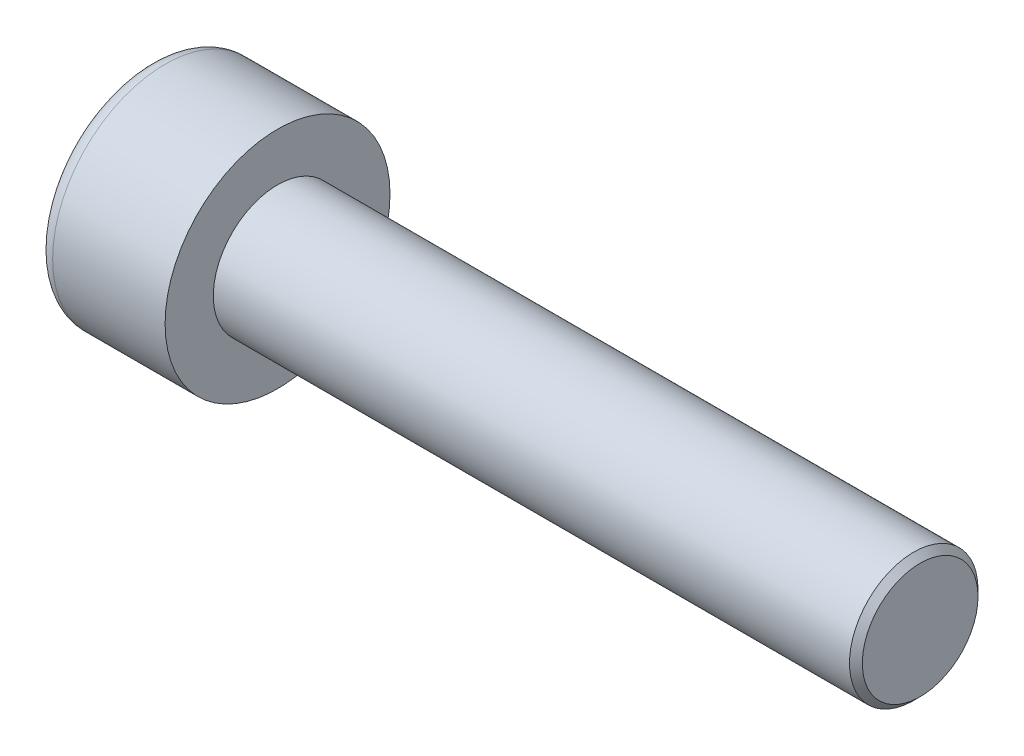
ISO-10303-21;
HEADER;
FILE_DESCRIPTION(('STEP AP214'),'2;1');
FILE_NAME('part.step','',(''),(''),'','','');
FILE_SCHEMA(('AUTOMOTIVE_DESIGN { 1 0 10303 214 1 1 1 1 }'));
ENDSEC;
DATA;
#1=APPLICATION_CONTEXT('core data for automotive mechanical design processes');
#2=APPLICATION_PROTOCOL_DEFINITION('international standard','automotive_design',2000,#1);
#3=PRODUCT_CONTEXT('',#1,'mechanical');
#4=PRODUCT('Part','Part','',(#3));
#5=PRODUCT_RELATED_PRODUCT_CATEGORY('part','',(#4));
#6=PRODUCT_DEFINITION_FORMATION('','',#4);
#7=PRODUCT_DEFINITION_CONTEXT('part definition',#1,'design');
#8=PRODUCT_DEFINITION('design','',#6,#7);
#9=PRODUCT_DEFINITION_SHAPE('','',#8);
#10=(LENGTH_UNIT() NAMED_UNIT(*) SI_UNIT(.MILLI.,.METRE.));
#11=(NAMED_UNIT(*) PLANE_ANGLE_UNIT() SI_UNIT($,.RADIAN.));
#12=(NAMED_UNIT(*) SI_UNIT($,.STERADIAN.) SOLID_ANGLE_UNIT());
#13=UNCERTAINTY_MEASURE_WITH_UNIT(LENGTH_MEASURE(1.E-05),#10,'distance_accuracy_value','');
#14=(GEOMETRIC_REPRESENTATION_CONTEXT(3) GLOBAL_UNCERTAINTY_ASSIGNED_CONTEXT((#13)) GLOBAL_UNIT_ASSIGNED_CONTEXT((#10,
#11,#12)) REPRESENTATION_CONTEXT('',''));
#15=CARTESIAN_POINT('',(0.,0.,0.));
#16=DIRECTION('',(0.,0.,1.));
#17=DIRECTION('',(1.,0.,0.));
#18=AXIS2_PLACEMENT_3D('',#15,#16,#17);
#19=CARTESIAN_POINT('',(2.,-3.,0.));
#20=DIRECTION('',(-1.,0.,0.));
#21=DIRECTION('',(0.,0.,1.));
#22=AXIS2_PLACEMENT_3D('',#19,#20,#21);
#23=PLANE('',#22);
#24=DIRECTION('',(0.,-0.866025403784438,-0.5));
#25=VECTOR('',#24,1.);
#26=CARTESIAN_POINT('',(2.,0.,1.73205080756888));
#27=LINE('',#26,#25);
#28=CARTESIAN_POINT('',(2.,-0.75,1.29903810567666));
#29=VERTEX_POINT('',#28);
#30=CARTESIAN_POINT('',(2.,-1.5,0.866025403784438));
#31=VERTEX_POINT('',#30);
#32=EDGE_CURVE('E150',#29,#31,#27,.T.);
#33=ORIENTED_EDGE('',*,*,#32,.F.);
#34=CARTESIAN_POINT('',(2.,0.,0.));
#35=DIRECTION('',(-1.,0.,0.));
#36=DIRECTION('',(0.,0.,1.));
#37=AXIS2_PLACEMENT_3D('',#34,#35,#36);
#38=CIRCLE('',#37,1.5);
#39=CARTESIAN_POINT('',(2.,-1.5,0.));
#40=VERTEX_POINT('',#39);
#41=EDGE_CURVE('E45',#29,#40,#38,.F.);
#42=ORIENTED_EDGE('',*,*,#41,.T.);
#43=DIRECTION('',(0.,0.,-1.));
#44=VECTOR('',#43,1.);
#45=CARTESIAN_POINT('',(2.,-1.5,0.866025403784438));
#46=LINE('',#45,#44);
#47=EDGE_CURVE('E155',#31,#40,#46,.T.);
#48=ORIENTED_EDGE('',*,*,#47,.F.);
#49=EDGE_LOOP('',(#33,#42,#48));
#50=FACE_BOUND('',#49,.T.);
#51=ADVANCED_FACE('F30',(#50),#23,.T.);
#52=CARTESIAN_POINT('',(2.,-1.5,-0.866025403784439));
#53=VERTEX_POINT('',#52);
#54=EDGE_CURVE('E154',#40,#53,#46,.T.);
#55=ORIENTED_EDGE('',*,*,#54,.F.);
#56=CARTESIAN_POINT('',(2.,-0.75,-1.29903810567666));
#57=VERTEX_POINT('',#56);
#58=EDGE_CURVE('E130',#40,#57,#38,.F.);
#59=ORIENTED_EDGE('',*,*,#58,.T.);
#60=DIRECTION('',(0.,0.866025403784439,-0.5));
#61=VECTOR('',#60,1.);
#62=CARTESIAN_POINT('',(2.,-1.5,-0.866025403784439));
#63=LINE('',#62,#61);
#64=EDGE_CURVE('E138',#53,#57,#63,.T.);
#65=ORIENTED_EDGE('',*,*,#64,.F.);
#66=EDGE_LOOP('',(#55,#59,#65));
#67=FACE_BOUND('',#66,.T.);
#68=ADVANCED_FACE('F210',(#67),#23,.T.);
#69=CARTESIAN_POINT('',(2.,0.,-1.73205080756888));
#70=VERTEX_POINT('',#69);
#71=EDGE_CURVE('E128',#57,#70,#63,.T.);
#72=ORIENTED_EDGE('',*,*,#71,.F.);
#73=CARTESIAN_POINT('',(2.,0.75,-1.29903810567666));
#74=VERTEX_POINT('',#73);
#75=EDGE_CURVE('E112',#57,#74,#38,.F.);
#76=ORIENTED_EDGE('',*,*,#75,.T.);
#77=DIRECTION('',(0.,0.866025403784439,0.5));
#78=VECTOR('',#77,1.);
#79=CARTESIAN_POINT('',(2.,0.,-1.73205080756888));
#80=LINE('',#79,#78);
#81=EDGE_CURVE('E126',#70,#74,#80,.T.);
#82=ORIENTED_EDGE('',*,*,#81,.F.);
#83=EDGE_LOOP('',(#72,#76,#82));
#84=FACE_BOUND('',#83,.T.);
#85=ADVANCED_FACE('F124',(#84),#23,.T.);
#86=CARTESIAN_POINT('',(2.,1.5,-0.866025403784438));
#87=VERTEX_POINT('',#86);
#88=EDGE_CURVE('E132',#74,#87,#80,.T.);
#89=ORIENTED_EDGE('',*,*,#88,.F.);
#90=CARTESIAN_POINT('',(2.,0.,0.));
#91=DIRECTION('',(1.,0.,0.));
#92=DIRECTION('',(0.,0.,-1.));
#93=AXIS2_PLACEMENT_3D('',#90,#91,#92);
#94=CIRCLE('',#93,1.5);
#95=CARTESIAN_POINT('',(2.,1.5,0.));
#96=VERTEX_POINT('',#95);
#97=EDGE_CURVE('E110',#74,#96,#94,.T.);
#98=ORIENTED_EDGE('',*,*,#97,.T.);
#99=DIRECTION('',(0.,0.,1.));
#100=VECTOR('',#99,1.);
#101=CARTESIAN_POINT('',(2.,1.5,-0.866025403784438));
#102=LINE('',#101,#100);
#103=EDGE_CURVE('E135',#87,#96,#102,.T.);
#104=ORIENTED_EDGE('',*,*,#103,.F.);
#105=EDGE_LOOP('',(#89,#98,#104));
#106=FACE_BOUND('',#105,.T.);
#107=ADVANCED_FACE('F133',(#106),#23,.T.);
#108=CARTESIAN_POINT('',(2.,1.5,0.866025403784439));
#109=VERTEX_POINT('',#108);
#110=EDGE_CURVE('E142',#96,#109,#102,.T.);
#111=ORIENTED_EDGE('',*,*,#110,.F.);
#112=CARTESIAN_POINT('',(2.,0.75,1.29903810567666));
#113=VERTEX_POINT('',#112);
#114=EDGE_CURVE('E115',#96,#113,#38,.F.);
#115=ORIENTED_EDGE('',*,*,#114,.T.);
#116=DIRECTION('',(0.,-0.866025403784439,0.5));
#117=VECTOR('',#116,1.);
#118=CARTESIAN_POINT('',(2.,1.5,0.866025403784439));
#119=LINE('',#118,#117);
#120=EDGE_CURVE('E147',#109,#113,#119,.T.);
#121=ORIENTED_EDGE('',*,*,#120,.F.);
#122=EDGE_LOOP('',(#111,#115,#121));
#123=FACE_BOUND('',#122,.T.);
#124=ADVANCED_FACE('F222',(#123),#23,.T.);
#125=CARTESIAN_POINT('',(2.,0.,1.73205080756888));
#126=VERTEX_POINT('',#125);
#127=EDGE_CURVE('E146',#113,#126,#119,.T.);
#128=ORIENTED_EDGE('',*,*,#127,.F.);
#129=EDGE_CURVE('E190',#113,#29,#38,.F.);
#130=ORIENTED_EDGE('',*,*,#129,.T.);
#131=EDGE_CURVE('E151',#126,#29,#27,.T.);
#132=ORIENTED_EDGE('',*,*,#131,.F.);
#133=EDGE_LOOP('',(#128,#130,#132));
#134=FACE_BOUND('',#133,.T.);
#135=ADVANCED_FACE('F213',(#134),#23,.T.);
#136=CARTESIAN_POINT('',(0.,0.,0.));
#137=DIRECTION('',(1.,0.,0.));
#138=DIRECTION('',(0.,0.,-1.));
#139=AXIS2_PLACEMENT_3D('',#136,#137,#138);
#140=PLANE('',#139);
#141=CARTESIAN_POINT('',(0.,0.,0.));
#142=DIRECTION('',(1.,0.,0.));
#143=DIRECTION('',(0.,0.,-1.));
#144=AXIS2_PLACEMENT_3D('',#141,#142,#143);
#145=CIRCLE('',#144,3.);
#146=CARTESIAN_POINT('',(0.,0.,-3.));
#147=VERTEX_POINT('',#146);
#148=EDGE_CURVE('E195',#147,#147,#145,.F.);
#149=ORIENTED_EDGE('',*,*,#148,.T.);
#150=EDGE_LOOP('',(#149));
#151=FACE_BOUND('',#150,.T.);
#152=DIRECTION('',(0.,0.866025403784439,-0.5));
#153=VECTOR('',#152,1.);
#154=CARTESIAN_POINT('',(0.,-1.5,-0.866025403784439));
#155=LINE('',#154,#153);
#156=CARTESIAN_POINT('',(0.,-1.5,-0.866025403784439));
#157=VERTEX_POINT('',#156);
#158=CARTESIAN_POINT('',(0.,0.,-1.73205080756888));
#159=VERTEX_POINT('',#158);
#160=EDGE_CURVE('E53',#157,#159,#155,.T.);
#161=ORIENTED_EDGE('',*,*,#160,.T.);
#162=DIRECTION('',(0.,0.866025403784439,0.5));
#163=VECTOR('',#162,1.);
#164=CARTESIAN_POINT('',(0.,0.,-1.73205080756888));
#165=LINE('',#164,#163);
#166=CARTESIAN_POINT('',(0.,1.5,-0.866025403784438));
#167=VERTEX_POINT('',#166);
#168=EDGE_CURVE('E160',#159,#167,#165,.T.);
#169=ORIENTED_EDGE('',*,*,#168,.T.);
#170=DIRECTION('',(0.,0.,1.));
#171=VECTOR('',#170,1.);
#172=CARTESIAN_POINT('',(0.,1.5,-0.866025403784438));
#173=LINE('',#172,#171);
#174=CARTESIAN_POINT('',(0.,1.5,0.866025403784439));
#175=VERTEX_POINT('',#174);
#176=EDGE_CURVE('E163',#167,#175,#173,.T.);
#177=ORIENTED_EDGE('',*,*,#176,.T.);
#178=DIRECTION('',(0.,-0.866025403784439,0.5));
#179=VECTOR('',#178,1.);
#180=CARTESIAN_POINT('',(0.,1.5,0.866025403784439));
#181=LINE('',#180,#179);
#182=CARTESIAN_POINT('',(0.,0.,1.73205080756888));
#183=VERTEX_POINT('',#182);
#184=EDGE_CURVE('E166',#175,#183,#181,.T.);
#185=ORIENTED_EDGE('',*,*,#184,.T.);
#186=DIRECTION('',(0.,-0.866025403784438,-0.5));
#187=VECTOR('',#186,1.);
#188=CARTESIAN_POINT('',(0.,0.,1.73205080756888));
#189=LINE('',#188,#187);
#190=CARTESIAN_POINT('',(0.,-1.5,0.866025403784438));
#191=VERTEX_POINT('',#190);
#192=EDGE_CURVE('E169',#183,#191,#189,.T.);
#193=ORIENTED_EDGE('',*,*,#192,.T.);
#194=DIRECTION('',(0.,0.,-1.));
#195=VECTOR('',#194,1.);
#196=CARTESIAN_POINT('',(0.,-1.5,0.866025403784438));
#197=LINE('',#196,#195);
#198=EDGE_CURVE('E172',#191,#157,#197,.T.);
#199=ORIENTED_EDGE('',*,*,#198,.T.);
#200=EDGE_LOOP('',(#161,#169,#177,#185,#193,#199));
#201=FACE_BOUND('',#200,.T.);
#202=ADVANCED_FACE('F221',(#151,#201),#140,.F.);
#203=CARTESIAN_POINT('',(4.,0.,0.));
#204=DIRECTION('',(1.,0.,0.));
#205=DIRECTION('',(0.,0.,-1.));
#206=AXIS2_PLACEMENT_3D('',#203,#204,#205);
#207=PLANE('',#206);
#208=CARTESIAN_POINT('',(4.,0.,0.));
#209=DIRECTION('',(1.,0.,0.));
#210=DIRECTION('',(0.,0.,-1.));
#211=AXIS2_PLACEMENT_3D('',#208,#209,#210);
#212=CIRCLE('',#211,3.5);
#213=CARTESIAN_POINT('',(4.,0.,-3.5));
#214=VERTEX_POINT('',#213);
#215=EDGE_CURVE('E188',#214,#214,#212,.T.);
#216=ORIENTED_EDGE('',*,*,#215,.T.);
#217=EDGE_LOOP('',(#216));
#218=FACE_BOUND('',#217,.T.);
#219=CARTESIAN_POINT('',(4.,0.,0.));
#220=DIRECTION('',(1.,0.,0.));
#221=DIRECTION('',(0.,0.,-1.));
#222=AXIS2_PLACEMENT_3D('',#219,#220,#221);
#223=CIRCLE('',#222,2.);
#224=CARTESIAN_POINT('',(4.,0.,-2.));
#225=VERTEX_POINT('',#224);
#226=EDGE_CURVE('E185',#225,#225,#223,.T.);
#227=ORIENTED_EDGE('',*,*,#226,.F.);
#228=EDGE_LOOP('',(#227));
#229=FACE_BOUND('',#228,.T.);
#230=ADVANCED_FACE('F228',(#218,#229),#207,.T.);
#231=CARTESIAN_POINT('',(4.,0.,0.));
#232=DIRECTION('',(-1.,0.,0.));
#233=DIRECTION('',(0.,0.,1.));
#234=AXIS2_PLACEMENT_3D('',#231,#232,#233);
#235=CYLINDRICAL_SURFACE('',#234,3.5);
#236=CARTESIAN_POINT('',(0.5,0.,0.));
#237=DIRECTION('',(1.,0.,0.));
#238=DIRECTION('',(0.,0.,-1.));
#239=AXIS2_PLACEMENT_3D('',#236,#237,#238);
#240=CIRCLE('',#239,3.5);
#241=CARTESIAN_POINT('',(0.5,0.,-3.5));
#242=VERTEX_POINT('',#241);
#243=EDGE_CURVE('E192',#242,#242,#240,.T.);
#244=ORIENTED_EDGE('',*,*,#243,.T.);
#245=EDGE_LOOP('',(#244));
#246=FACE_BOUND('',#245,.T.);
#247=ORIENTED_EDGE('',*,*,#215,.F.);
#248=EDGE_LOOP('',(#247));
#249=FACE_BOUND('',#248,.T.);
#250=ADVANCED_FACE('F273',(#246,#249),#235,.T.);
#251=CARTESIAN_POINT('',(24.,0.,0.));
#252=DIRECTION('',(-1.,0.,0.));
#253=DIRECTION('',(0.,0.,1.));
#254=AXIS2_PLACEMENT_3D('',#251,#252,#253);
#255=CYLINDRICAL_SURFACE('',#254,2.);
#256=CARTESIAN_POINT('',(23.8,0.,0.));
#257=DIRECTION('',(1.,0.,0.));
#258=DIRECTION('',(0.,0.,-1.));
#259=AXIS2_PLACEMENT_3D('',#256,#257,#258);
#260=CIRCLE('',#259,2.);
#261=CARTESIAN_POINT('',(23.8,0.,-2.));
#262=VERTEX_POINT('',#261);
#263=EDGE_CURVE('E11',#262,#262,#260,.F.);
#264=ORIENTED_EDGE('',*,*,#263,.T.);
#265=EDGE_LOOP('',(#264));
#266=FACE_BOUND('',#265,.T.);
#267=ORIENTED_EDGE('',*,*,#226,.T.);
#268=EDGE_LOOP('',(#267));
#269=FACE_BOUND('',#268,.T.);
#270=ADVANCED_FACE('F270',(#266,#269),#255,.T.);
#271=CARTESIAN_POINT('',(24.,0.,0.));
#272=DIRECTION('',(1.,0.,0.));
#273=DIRECTION('',(0.,0.,-1.));
#274=AXIS2_PLACEMENT_3D('',#271,#272,#273);
#275=PLANE('',#274);
#276=CARTESIAN_POINT('',(24.,0.,0.));
#277=DIRECTION('',(1.,0.,0.));
#278=DIRECTION('',(0.,0.,-1.));
#279=AXIS2_PLACEMENT_3D('',#276,#277,#278);
#280=CIRCLE('',#279,1.8);
#281=CARTESIAN_POINT('',(24.,0.,-1.8));
#282=VERTEX_POINT('',#281);
#283=EDGE_CURVE('E38',#282,#282,#280,.T.);
#284=ORIENTED_EDGE('',*,*,#283,.T.);
#285=EDGE_LOOP('',(#284));
#286=FACE_BOUND('',#285,.T.);
#287=ADVANCED_FACE('F200',(#286),#275,.T.);
#288=CARTESIAN_POINT('',(2.,-1.5,-0.866025403784439));
#289=DIRECTION('',(0.,0.5,0.866025403784439));
#290=DIRECTION('',(0.,-0.866025403784439,0.5));
#291=AXIS2_PLACEMENT_3D('',#288,#289,#290);
#292=PLANE('',#291);
#293=ORIENTED_EDGE('',*,*,#160,.F.);
#294=DIRECTION('',(-1.,0.,0.));
#295=VECTOR('',#294,1.);
#296=CARTESIAN_POINT('',(2.,-1.5,-0.866025403784439));
#297=LINE('',#296,#295);
#298=EDGE_CURVE('E158',#53,#157,#297,.T.);
#299=ORIENTED_EDGE('',*,*,#298,.F.);
#300=ORIENTED_EDGE('',*,*,#64,.T.);
#301=ORIENTED_EDGE('',*,*,#71,.T.);
#302=DIRECTION('',(-1.,0.,0.));
#303=VECTOR('',#302,1.);
#304=CARTESIAN_POINT('',(2.,0.,-1.73205080756888));
#305=LINE('',#304,#303);
#306=EDGE_CURVE('E141',#70,#159,#305,.T.);
#307=ORIENTED_EDGE('',*,*,#306,.T.);
#308=EDGE_LOOP('',(#293,#299,#300,#301,#307));
#309=FACE_BOUND('',#308,.T.);
#310=ADVANCED_FACE('F244',(#309),#292,.T.);
#311=CARTESIAN_POINT('',(2.,0.,-1.73205080756888));
#312=DIRECTION('',(0.,-0.5,0.866025403784438));
#313=DIRECTION('',(0.,-0.866025403784439,-0.5));
#314=AXIS2_PLACEMENT_3D('',#311,#312,#313);
#315=PLANE('',#314);
#316=ORIENTED_EDGE('',*,*,#168,.F.);
#317=ORIENTED_EDGE('',*,*,#306,.F.);
#318=ORIENTED_EDGE('',*,*,#81,.T.);
#319=ORIENTED_EDGE('',*,*,#88,.T.);
#320=DIRECTION('',(-1.,0.,0.));
#321=VECTOR('',#320,1.);
#322=CARTESIAN_POINT('',(2.,1.5,-0.866025403784438));
#323=LINE('',#322,#321);
#324=EDGE_CURVE('E182',#87,#167,#323,.T.);
#325=ORIENTED_EDGE('',*,*,#324,.T.);
#326=EDGE_LOOP('',(#316,#317,#318,#319,#325));
#327=FACE_BOUND('',#326,.T.);
#328=ADVANCED_FACE('F140',(#327),#315,.T.);
#329=CARTESIAN_POINT('',(2.,1.5,-0.866025403784438));
#330=DIRECTION('',(0.,-1.,0.));
#331=DIRECTION('',(0.,0.,-1.));
#332=AXIS2_PLACEMENT_3D('',#329,#330,#331);
#333=PLANE('',#332);
#334=ORIENTED_EDGE('',*,*,#176,.F.);
#335=ORIENTED_EDGE('',*,*,#324,.F.);
#336=ORIENTED_EDGE('',*,*,#103,.T.);
#337=ORIENTED_EDGE('',*,*,#110,.T.);
#338=DIRECTION('',(-1.,0.,0.));
#339=VECTOR('',#338,1.);
#340=CARTESIAN_POINT('',(2.,1.5,0.866025403784439));
#341=LINE('',#340,#339);
#342=EDGE_CURVE('E180',#109,#175,#341,.T.);
#343=ORIENTED_EDGE('',*,*,#342,.T.);
#344=EDGE_LOOP('',(#334,#335,#336,#337,#343));
#345=FACE_BOUND('',#344,.T.);
#346=ADVANCED_FACE('F242',(#345),#333,.T.);
#347=CARTESIAN_POINT('',(2.,1.5,0.866025403784439));
#348=DIRECTION('',(0.,-0.5,-0.866025403784439));
#349=DIRECTION('',(0.,0.866025403784439,-0.5));
#350=AXIS2_PLACEMENT_3D('',#347,#348,#349);
#351=PLANE('',#350);
#352=ORIENTED_EDGE('',*,*,#184,.F.);
#353=ORIENTED_EDGE('',*,*,#342,.F.);
#354=ORIENTED_EDGE('',*,*,#120,.T.);
#355=ORIENTED_EDGE('',*,*,#127,.T.);
#356=DIRECTION('',(-1.,0.,0.));
#357=VECTOR('',#356,1.);
#358=CARTESIAN_POINT('',(2.,0.,1.73205080756888));
#359=LINE('',#358,#357);
#360=EDGE_CURVE('E178',#126,#183,#359,.T.);
#361=ORIENTED_EDGE('',*,*,#360,.T.);
#362=EDGE_LOOP('',(#352,#353,#354,#355,#361));
#363=FACE_BOUND('',#362,.T.);
#364=ADVANCED_FACE('F239',(#363),#351,.T.);
#365=CARTESIAN_POINT('',(2.,0.,1.73205080756888));
#366=DIRECTION('',(0.,0.5,-0.866025403784438));
#367=DIRECTION('',(0.,0.866025403784438,0.5));
#368=AXIS2_PLACEMENT_3D('',#365,#366,#367);
#369=PLANE('',#368);
#370=ORIENTED_EDGE('',*,*,#192,.F.);
#371=ORIENTED_EDGE('',*,*,#360,.F.);
#372=ORIENTED_EDGE('',*,*,#131,.T.);
#373=ORIENTED_EDGE('',*,*,#32,.T.);
#374=DIRECTION('',(-1.,0.,0.));
#375=VECTOR('',#374,1.);
#376=CARTESIAN_POINT('',(2.,-1.5,0.866025403784438));
#377=LINE('',#376,#375);
#378=EDGE_CURVE('E176',#31,#191,#377,.T.);
#379=ORIENTED_EDGE('',*,*,#378,.T.);
#380=EDGE_LOOP('',(#370,#371,#372,#373,#379));
#381=FACE_BOUND('',#380,.T.);
#382=ADVANCED_FACE('F253',(#381),#369,.T.);
#383=CARTESIAN_POINT('',(2.,-1.5,0.866025403784438));
#384=DIRECTION('',(0.,1.,0.));
#385=DIRECTION('',(0.,0.,1.));
#386=AXIS2_PLACEMENT_3D('',#383,#384,#385);
#387=PLANE('',#386);
#388=ORIENTED_EDGE('',*,*,#198,.F.);
#389=ORIENTED_EDGE('',*,*,#378,.F.);
#390=ORIENTED_EDGE('',*,*,#47,.T.);
#391=ORIENTED_EDGE('',*,*,#54,.T.);
#392=ORIENTED_EDGE('',*,*,#298,.T.);
#393=EDGE_LOOP('',(#388,#389,#390,#391,#392));
#394=FACE_BOUND('',#393,.T.);
#395=ADVANCED_FACE('F107',(#394),#387,.T.);
#396=CARTESIAN_POINT('',(2.,0.,0.));
#397=DIRECTION('',(-1.,0.,0.));
#398=DIRECTION('',(0.,0.,1.));
#399=AXIS2_PLACEMENT_3D('',#396,#397,#398);
#400=CONICAL_SURFACE('',#399,1.5,1.04719755119659);
#401=CARTESIAN_POINT('',(2.86602540378445,0.,0.));
#402=VERTEX_POINT('',#401);
#403=VERTEX_LOOP('',#402);
#404=FACE_BOUND('',#403,.T.);
#405=ORIENTED_EDGE('',*,*,#97,.F.);
#406=ORIENTED_EDGE('',*,*,#75,.F.);
#407=ORIENTED_EDGE('',*,*,#58,.F.);
#408=ORIENTED_EDGE('',*,*,#41,.F.);
#409=ORIENTED_EDGE('',*,*,#129,.F.);
#410=ORIENTED_EDGE('',*,*,#114,.F.);
#411=EDGE_LOOP('',(#405,#406,#407,#408,#409,#410));
#412=FACE_BOUND('',#411,.T.);
#413=ADVANCED_FACE('F104',(#404,#412),#400,.F.);
#414=CARTESIAN_POINT('',(0.5,0.,0.));
#415=DIRECTION('',(1.,0.,0.));
#416=DIRECTION('',(0.,0.,-1.));
#417=AXIS2_PLACEMENT_3D('',#414,#415,#416);
#418=TOROIDAL_SURFACE('',#417,3.,0.5);
#419=ORIENTED_EDGE('',*,*,#148,.F.);
#420=EDGE_LOOP('',(#419));
#421=FACE_BOUND('',#420,.T.);
#422=ORIENTED_EDGE('',*,*,#243,.F.);
#423=EDGE_LOOP('',(#422));
#424=FACE_BOUND('',#423,.T.);
#425=ADVANCED_FACE('F106',(#421,#424),#418,.T.);
#426=CARTESIAN_POINT('',(24.,0.,0.));
#427=DIRECTION('',(-1.,0.,0.));
#428=DIRECTION('',(0.,0.,1.));
#429=AXIS2_PLACEMENT_3D('',#426,#427,#428);
#430=CONICAL_SURFACE('',#429,1.8,0.785398163397435);
#431=ORIENTED_EDGE('',*,*,#263,.F.);
#432=EDGE_LOOP('',(#431));
#433=FACE_BOUND('',#432,.T.);
#434=ORIENTED_EDGE('',*,*,#283,.F.);
#435=EDGE_LOOP('',(#434));
#436=FACE_BOUND('',#435,.T.);
#437=ADVANCED_FACE('F32',(#433,#436),#430,.T.);
#438=CLOSED_SHELL('',(#51,#68,#85,#107,#124,#135,#202,#230,#250,#270,#287,#310,#328,#346,#364,
#382,#395,#413,#425,#437));
#439=MANIFOLD_SOLID_BREP('B2',#438);
#440=ADVANCED_BREP_SHAPE_REPRESENTATION('',(#18,#439),#14);
#441=SHAPE_DEFINITION_REPRESENTATION(#9,#440);
ENDSEC;
END-ISO-10303-21;
